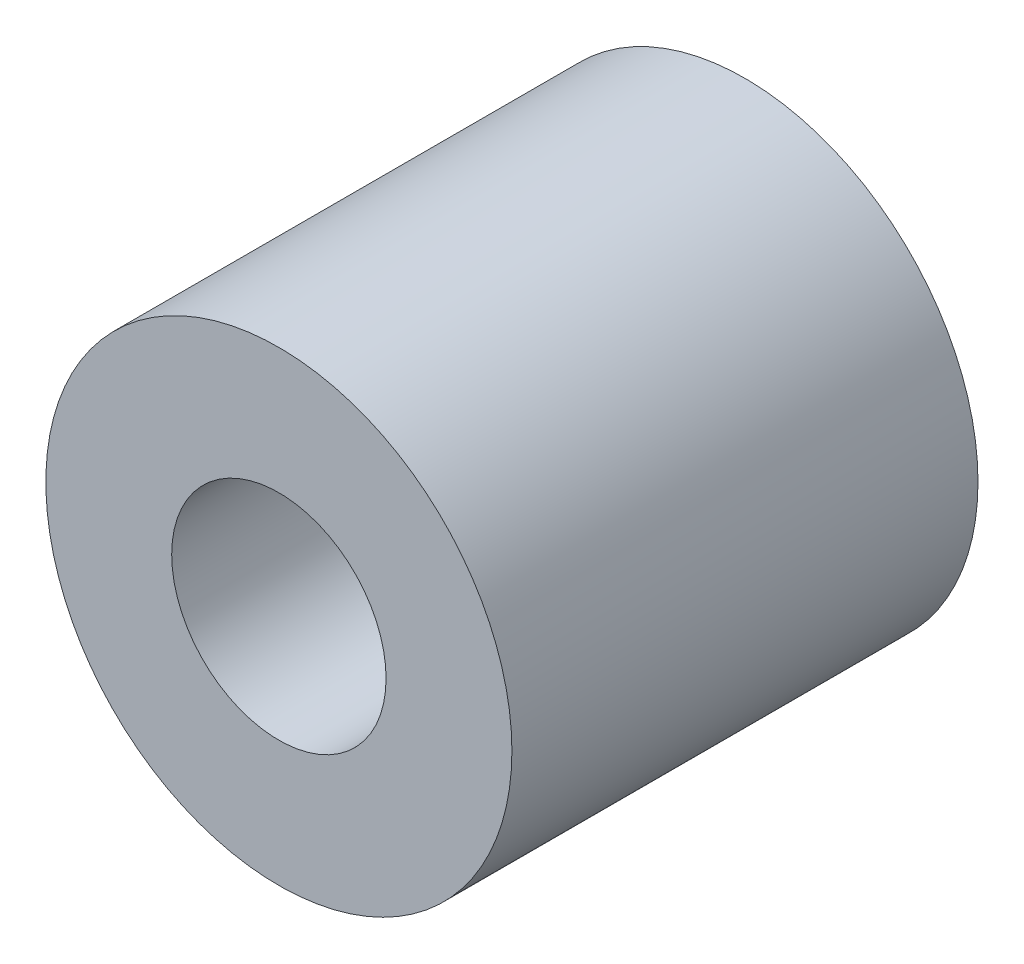
ISO-10303-21;
HEADER;
FILE_DESCRIPTION(('STEP AP214'),'2;1');
FILE_NAME('part.step','',(''),(''),'','','');
FILE_SCHEMA(('AUTOMOTIVE_DESIGN { 1 0 10303 214 1 1 1 1 }'));
ENDSEC;
DATA;
#1=APPLICATION_CONTEXT('core data for automotive mechanical design processes');
#2=APPLICATION_PROTOCOL_DEFINITION('international standard','automotive_design',2000,#1);
#3=PRODUCT_CONTEXT('',#1,'mechanical');
#4=PRODUCT('Part','Part','',(#3));
#5=PRODUCT_RELATED_PRODUCT_CATEGORY('part','',(#4));
#6=PRODUCT_DEFINITION_FORMATION('','',#4);
#7=PRODUCT_DEFINITION_CONTEXT('part definition',#1,'design');
#8=PRODUCT_DEFINITION('design','',#6,#7);
#9=PRODUCT_DEFINITION_SHAPE('','',#8);
#10=(LENGTH_UNIT() NAMED_UNIT(*) SI_UNIT(.MILLI.,.METRE.));
#11=(NAMED_UNIT(*) PLANE_ANGLE_UNIT() SI_UNIT($,.RADIAN.));
#12=(NAMED_UNIT(*) SI_UNIT($,.STERADIAN.) SOLID_ANGLE_UNIT());
#13=UNCERTAINTY_MEASURE_WITH_UNIT(LENGTH_MEASURE(1.E-05),#10,'distance_accuracy_value','');
#14=(GEOMETRIC_REPRESENTATION_CONTEXT(3) GLOBAL_UNCERTAINTY_ASSIGNED_CONTEXT((#13)) GLOBAL_UNIT_ASSIGNED_CONTEXT((#10,
#11,#12)) REPRESENTATION_CONTEXT('',''));
#15=CARTESIAN_POINT('',(0.,0.,0.));
#16=DIRECTION('',(0.,0.,1.));
#17=DIRECTION('',(1.,0.,0.));
#18=AXIS2_PLACEMENT_3D('',#15,#16,#17);
#19=CARTESIAN_POINT('',(0.,0.,3.175));
#20=DIRECTION('',(0.,0.,1.));
#21=DIRECTION('',(1.,0.,0.));
#22=AXIS2_PLACEMENT_3D('',#19,#20,#21);
#23=PLANE('',#22);
#24=CARTESIAN_POINT('',(0.,0.,3.175));
#25=DIRECTION('',(0.,0.,1.));
#26=DIRECTION('',(1.,0.,0.));
#27=AXIS2_PLACEMENT_3D('',#24,#25,#26);
#28=CIRCLE('',#27,3.175);
#29=CARTESIAN_POINT('',(3.175,0.,3.175));
#30=VERTEX_POINT('',#29);
#31=EDGE_CURVE('E10',#30,#30,#28,.T.);
#32=ORIENTED_EDGE('',*,*,#31,.T.);
#33=EDGE_LOOP('',(#32));
#34=FACE_BOUND('',#33,.T.);
#35=CARTESIAN_POINT('',(0.,0.,3.175));
#36=DIRECTION('',(0.,0.,1.));
#37=DIRECTION('',(1.,0.,0.));
#38=AXIS2_PLACEMENT_3D('',#35,#36,#37);
#39=CIRCLE('',#38,1.4605);
#40=CARTESIAN_POINT('',(1.4605,0.,3.175));
#41=VERTEX_POINT('',#40);
#42=EDGE_CURVE('E41',#41,#41,#39,.T.);
#43=ORIENTED_EDGE('',*,*,#42,.F.);
#44=EDGE_LOOP('',(#43));
#45=FACE_BOUND('',#44,.T.);
#46=ADVANCED_FACE('F30',(#34,#45),#23,.T.);
#47=CARTESIAN_POINT('',(0.,0.,-3.175));
#48=DIRECTION('',(0.,0.,1.));
#49=DIRECTION('',(1.,0.,0.));
#50=AXIS2_PLACEMENT_3D('',#47,#48,#49);
#51=PLANE('',#50);
#52=CARTESIAN_POINT('',(0.,0.,-3.175));
#53=DIRECTION('',(0.,0.,1.));
#54=DIRECTION('',(1.,0.,0.));
#55=AXIS2_PLACEMENT_3D('',#52,#53,#54);
#56=CIRCLE('',#55,3.175);
#57=CARTESIAN_POINT('',(3.175,0.,-3.175));
#58=VERTEX_POINT('',#57);
#59=EDGE_CURVE('E34',#58,#58,#56,.T.);
#60=ORIENTED_EDGE('',*,*,#59,.F.);
#61=EDGE_LOOP('',(#60));
#62=FACE_BOUND('',#61,.T.);
#63=CARTESIAN_POINT('',(0.,0.,-3.175));
#64=DIRECTION('',(0.,0.,1.));
#65=DIRECTION('',(1.,0.,0.));
#66=AXIS2_PLACEMENT_3D('',#63,#64,#65);
#67=CIRCLE('',#66,1.4605);
#68=CARTESIAN_POINT('',(1.4605,0.,-3.175));
#69=VERTEX_POINT('',#68);
#70=EDGE_CURVE('E43',#69,#69,#67,.T.);
#71=ORIENTED_EDGE('',*,*,#70,.T.);
#72=EDGE_LOOP('',(#71));
#73=FACE_BOUND('',#72,.T.);
#74=ADVANCED_FACE('F53',(#62,#73),#51,.F.);
#75=CARTESIAN_POINT('',(0.,0.,3.175));
#76=DIRECTION('',(0.,0.,-1.));
#77=DIRECTION('',(-1.,0.,0.));
#78=AXIS2_PLACEMENT_3D('',#75,#76,#77);
#79=CYLINDRICAL_SURFACE('',#78,3.175);
#80=ORIENTED_EDGE('',*,*,#31,.F.);
#81=EDGE_LOOP('',(#80));
#82=FACE_BOUND('',#81,.T.);
#83=ORIENTED_EDGE('',*,*,#59,.T.);
#84=EDGE_LOOP('',(#83));
#85=FACE_BOUND('',#84,.T.);
#86=ADVANCED_FACE('F32',(#82,#85),#79,.T.);
#87=CARTESIAN_POINT('',(0.,0.,3.175));
#88=DIRECTION('',(0.,0.,-1.));
#89=DIRECTION('',(-1.,0.,0.));
#90=AXIS2_PLACEMENT_3D('',#87,#88,#89);
#91=CYLINDRICAL_SURFACE('',#90,1.4605);
#92=ORIENTED_EDGE('',*,*,#42,.T.);
#93=EDGE_LOOP('',(#92));
#94=FACE_BOUND('',#93,.T.);
#95=ORIENTED_EDGE('',*,*,#70,.F.);
#96=EDGE_LOOP('',(#95));
#97=FACE_BOUND('',#96,.T.);
#98=ADVANCED_FACE('F49',(#94,#97),#91,.F.);
#99=CLOSED_SHELL('',(#46,#74,#86,#98));
#100=MANIFOLD_SOLID_BREP('B2',#99);
#101=ADVANCED_BREP_SHAPE_REPRESENTATION('',(#18,#100),#14);
#102=SHAPE_DEFINITION_REPRESENTATION(#9,#101);
ENDSEC;
END-ISO-10303-21;
